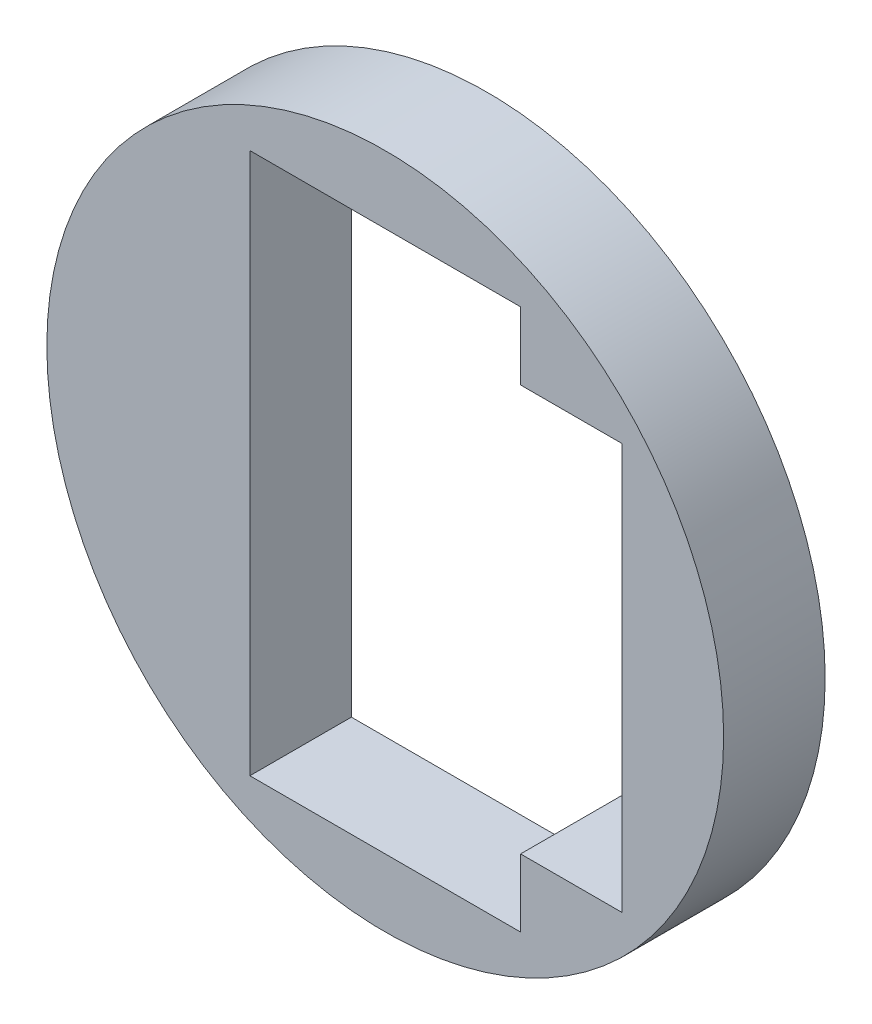
ISO-10303-21;
HEADER;
FILE_DESCRIPTION(('STEP AP214'),'2;1');
FILE_NAME('part.step','',(''),(''),'','','');
FILE_SCHEMA(('AUTOMOTIVE_DESIGN { 1 0 10303 214 1 1 1 1 }'));
ENDSEC;
DATA;
#1=APPLICATION_CONTEXT('core data for automotive mechanical design processes');
#2=APPLICATION_PROTOCOL_DEFINITION('international standard','automotive_design',2000,#1);
#3=PRODUCT_CONTEXT('',#1,'mechanical');
#4=PRODUCT('Part','Part','',(#3));
#5=PRODUCT_RELATED_PRODUCT_CATEGORY('part','',(#4));
#6=PRODUCT_DEFINITION_FORMATION('','',#4);
#7=PRODUCT_DEFINITION_CONTEXT('part definition',#1,'design');
#8=PRODUCT_DEFINITION('design','',#6,#7);
#9=PRODUCT_DEFINITION_SHAPE('','',#8);
#10=(LENGTH_UNIT() NAMED_UNIT(*) SI_UNIT(.MILLI.,.METRE.));
#11=(NAMED_UNIT(*) PLANE_ANGLE_UNIT() SI_UNIT($,.RADIAN.));
#12=(NAMED_UNIT(*) SI_UNIT($,.STERADIAN.) SOLID_ANGLE_UNIT());
#13=UNCERTAINTY_MEASURE_WITH_UNIT(LENGTH_MEASURE(1.E-05),#10,'distance_accuracy_value','');
#14=(GEOMETRIC_REPRESENTATION_CONTEXT(3) GLOBAL_UNCERTAINTY_ASSIGNED_CONTEXT((#13)) GLOBAL_UNIT_ASSIGNED_CONTEXT((#10,
#11,#12)) REPRESENTATION_CONTEXT('',''));
#15=CARTESIAN_POINT('',(0.,0.,0.));
#16=DIRECTION('',(0.,0.,1.));
#17=DIRECTION('',(1.,0.,0.));
#18=AXIS2_PLACEMENT_3D('',#15,#16,#17);
#19=CARTESIAN_POINT('',(0.,0.,3.));
#20=DIRECTION('',(0.,0.,-1.));
#21=DIRECTION('',(-1.,0.,0.));
#22=AXIS2_PLACEMENT_3D('',#19,#20,#21);
#23=CYLINDRICAL_SURFACE('',#22,10.);
#24=CARTESIAN_POINT('',(0.,0.,3.));
#25=DIRECTION('',(0.,0.,1.));
#26=DIRECTION('',(1.,0.,0.));
#27=AXIS2_PLACEMENT_3D('',#24,#25,#26);
#28=CIRCLE('',#27,10.);
#29=CARTESIAN_POINT('',(10.,0.,3.));
#30=VERTEX_POINT('',#29);
#31=EDGE_CURVE('E11',#30,#30,#28,.T.);
#32=ORIENTED_EDGE('',*,*,#31,.F.);
#33=EDGE_LOOP('',(#32));
#34=FACE_BOUND('',#33,.T.);
#35=CARTESIAN_POINT('',(0.,0.,0.));
#36=DIRECTION('',(0.,0.,1.));
#37=DIRECTION('',(1.,0.,0.));
#38=AXIS2_PLACEMENT_3D('',#35,#36,#37);
#39=CIRCLE('',#38,10.);
#40=CARTESIAN_POINT('',(10.,0.,0.));
#41=VERTEX_POINT('',#40);
#42=EDGE_CURVE('E36',#41,#41,#39,.T.);
#43=ORIENTED_EDGE('',*,*,#42,.T.);
#44=EDGE_LOOP('',(#43));
#45=FACE_BOUND('',#44,.T.);
#46=ADVANCED_FACE('F33',(#34,#45),#23,.T.);
#47=CARTESIAN_POINT('',(0.,0.,3.));
#48=DIRECTION('',(0.,0.,1.));
#49=DIRECTION('',(1.,0.,0.));
#50=AXIS2_PLACEMENT_3D('',#47,#48,#49);
#51=PLANE('',#50);
#52=DIRECTION('',(-1.,0.,0.));
#53=VECTOR('',#52,1.);
#54=CARTESIAN_POINT('',(4.,8.,3.));
#55=LINE('',#54,#53);
#56=CARTESIAN_POINT('',(4.,8.,3.));
#57=VERTEX_POINT('',#56);
#58=CARTESIAN_POINT('',(-4.,8.,3.));
#59=VERTEX_POINT('',#58);
#60=EDGE_CURVE('E47',#57,#59,#55,.T.);
#61=ORIENTED_EDGE('',*,*,#60,.F.);
#62=DIRECTION('',(0.,1.,0.));
#63=VECTOR('',#62,1.);
#64=CARTESIAN_POINT('',(4.,6.,3.));
#65=LINE('',#64,#63);
#66=CARTESIAN_POINT('',(4.,6.,3.));
#67=VERTEX_POINT('',#66);
#68=EDGE_CURVE('E116',#67,#57,#65,.T.);
#69=ORIENTED_EDGE('',*,*,#68,.F.);
#70=DIRECTION('',(-1.,0.,0.));
#71=VECTOR('',#70,1.);
#72=CARTESIAN_POINT('',(7.,6.,3.));
#73=LINE('',#72,#71);
#74=CARTESIAN_POINT('',(7.,6.,3.));
#75=VERTEX_POINT('',#74);
#76=EDGE_CURVE('E119',#75,#67,#73,.T.);
#77=ORIENTED_EDGE('',*,*,#76,.F.);
#78=DIRECTION('',(0.,1.,0.));
#79=VECTOR('',#78,1.);
#80=CARTESIAN_POINT('',(7.,-6.,3.));
#81=LINE('',#80,#79);
#82=CARTESIAN_POINT('',(7.,-6.,3.));
#83=VERTEX_POINT('',#82);
#84=EDGE_CURVE('E147',#83,#75,#81,.T.);
#85=ORIENTED_EDGE('',*,*,#84,.F.);
#86=DIRECTION('',(1.,0.,0.));
#87=VECTOR('',#86,1.);
#88=CARTESIAN_POINT('',(4.,-6.,3.));
#89=LINE('',#88,#87);
#90=CARTESIAN_POINT('',(4.,-6.,3.));
#91=VERTEX_POINT('',#90);
#92=EDGE_CURVE('E144',#91,#83,#89,.T.);
#93=ORIENTED_EDGE('',*,*,#92,.F.);
#94=DIRECTION('',(0.,1.,0.));
#95=VECTOR('',#94,1.);
#96=CARTESIAN_POINT('',(4.,-8.,3.));
#97=LINE('',#96,#95);
#98=CARTESIAN_POINT('',(4.,-8.,3.));
#99=VERTEX_POINT('',#98);
#100=EDGE_CURVE('E141',#99,#91,#97,.T.);
#101=ORIENTED_EDGE('',*,*,#100,.F.);
#102=DIRECTION('',(1.,0.,0.));
#103=VECTOR('',#102,1.);
#104=CARTESIAN_POINT('',(-4.,-8.,3.));
#105=LINE('',#104,#103);
#106=CARTESIAN_POINT('',(-4.,-8.,3.));
#107=VERTEX_POINT('',#106);
#108=EDGE_CURVE('E138',#107,#99,#105,.T.);
#109=ORIENTED_EDGE('',*,*,#108,.F.);
#110=DIRECTION('',(0.,-1.,0.));
#111=VECTOR('',#110,1.);
#112=CARTESIAN_POINT('',(-4.,8.,3.));
#113=LINE('',#112,#111);
#114=EDGE_CURVE('E136',#59,#107,#113,.T.);
#115=ORIENTED_EDGE('',*,*,#114,.F.);
#116=EDGE_LOOP('',(#61,#69,#77,#85,#93,#101,#109,#115));
#117=FACE_BOUND('',#116,.T.);
#118=ORIENTED_EDGE('',*,*,#31,.T.);
#119=EDGE_LOOP('',(#118));
#120=FACE_BOUND('',#119,.T.);
#121=ADVANCED_FACE('F168',(#117,#120),#51,.T.);
#122=CARTESIAN_POINT('',(0.,0.,0.));
#123=DIRECTION('',(0.,0.,1.));
#124=DIRECTION('',(1.,0.,0.));
#125=AXIS2_PLACEMENT_3D('',#122,#123,#124);
#126=PLANE('',#125);
#127=DIRECTION('',(0.,1.,0.));
#128=VECTOR('',#127,1.);
#129=CARTESIAN_POINT('',(4.,6.,0.));
#130=LINE('',#129,#128);
#131=CARTESIAN_POINT('',(4.,6.,0.));
#132=VERTEX_POINT('',#131);
#133=CARTESIAN_POINT('',(4.,8.,0.));
#134=VERTEX_POINT('',#133);
#135=EDGE_CURVE('E105',#132,#134,#130,.T.);
#136=ORIENTED_EDGE('',*,*,#135,.T.);
#137=DIRECTION('',(-1.,0.,0.));
#138=VECTOR('',#137,1.);
#139=CARTESIAN_POINT('',(4.,8.,0.));
#140=LINE('',#139,#138);
#141=CARTESIAN_POINT('',(-4.,8.,0.));
#142=VERTEX_POINT('',#141);
#143=EDGE_CURVE('E99',#134,#142,#140,.T.);
#144=ORIENTED_EDGE('',*,*,#143,.T.);
#145=DIRECTION('',(0.,-1.,0.));
#146=VECTOR('',#145,1.);
#147=CARTESIAN_POINT('',(-4.,8.,0.));
#148=LINE('',#147,#146);
#149=CARTESIAN_POINT('',(-4.,-8.,0.));
#150=VERTEX_POINT('',#149);
#151=EDGE_CURVE('E108',#142,#150,#148,.T.);
#152=ORIENTED_EDGE('',*,*,#151,.T.);
#153=DIRECTION('',(1.,0.,0.));
#154=VECTOR('',#153,1.);
#155=CARTESIAN_POINT('',(-4.,-8.,0.));
#156=LINE('',#155,#154);
#157=CARTESIAN_POINT('',(4.,-8.,0.));
#158=VERTEX_POINT('',#157);
#159=EDGE_CURVE('E55',#150,#158,#156,.T.);
#160=ORIENTED_EDGE('',*,*,#159,.T.);
#161=DIRECTION('',(0.,1.,0.));
#162=VECTOR('',#161,1.);
#163=CARTESIAN_POINT('',(4.,-8.,0.));
#164=LINE('',#163,#162);
#165=CARTESIAN_POINT('',(4.,-6.,0.));
#166=VERTEX_POINT('',#165);
#167=EDGE_CURVE('E123',#158,#166,#164,.T.);
#168=ORIENTED_EDGE('',*,*,#167,.T.);
#169=DIRECTION('',(1.,0.,0.));
#170=VECTOR('',#169,1.);
#171=CARTESIAN_POINT('',(4.,-6.,0.));
#172=LINE('',#171,#170);
#173=CARTESIAN_POINT('',(7.,-6.,0.));
#174=VERTEX_POINT('',#173);
#175=EDGE_CURVE('E126',#166,#174,#172,.T.);
#176=ORIENTED_EDGE('',*,*,#175,.T.);
#177=DIRECTION('',(0.,1.,0.));
#178=VECTOR('',#177,1.);
#179=CARTESIAN_POINT('',(7.,-6.,0.));
#180=LINE('',#179,#178);
#181=CARTESIAN_POINT('',(7.,6.,0.));
#182=VERTEX_POINT('',#181);
#183=EDGE_CURVE('E129',#174,#182,#180,.T.);
#184=ORIENTED_EDGE('',*,*,#183,.T.);
#185=DIRECTION('',(-1.,0.,0.));
#186=VECTOR('',#185,1.);
#187=CARTESIAN_POINT('',(7.,6.,0.));
#188=LINE('',#187,#186);
#189=EDGE_CURVE('E132',#182,#132,#188,.T.);
#190=ORIENTED_EDGE('',*,*,#189,.T.);
#191=EDGE_LOOP('',(#136,#144,#152,#160,#168,#176,#184,#190));
#192=FACE_BOUND('',#191,.T.);
#193=ORIENTED_EDGE('',*,*,#42,.F.);
#194=EDGE_LOOP('',(#193));
#195=FACE_BOUND('',#194,.T.);
#196=ADVANCED_FACE('F112',(#192,#195),#126,.F.);
#197=CARTESIAN_POINT('',(4.,8.,0.));
#198=DIRECTION('',(0.,1.,0.));
#199=DIRECTION('',(-1.,0.,0.));
#200=AXIS2_PLACEMENT_3D('',#197,#198,#199);
#201=PLANE('',#200);
#202=ORIENTED_EDGE('',*,*,#60,.T.);
#203=DIRECTION('',(0.,0.,1.));
#204=VECTOR('',#203,1.);
#205=CARTESIAN_POINT('',(-4.,8.,0.));
#206=LINE('',#205,#204);
#207=EDGE_CURVE('E95',#142,#59,#206,.T.);
#208=ORIENTED_EDGE('',*,*,#207,.F.);
#209=ORIENTED_EDGE('',*,*,#143,.F.);
#210=DIRECTION('',(0.,0.,1.));
#211=VECTOR('',#210,1.);
#212=CARTESIAN_POINT('',(4.,8.,0.));
#213=LINE('',#212,#211);
#214=EDGE_CURVE('E152',#134,#57,#213,.T.);
#215=ORIENTED_EDGE('',*,*,#214,.T.);
#216=EDGE_LOOP('',(#202,#208,#209,#215));
#217=FACE_BOUND('',#216,.T.);
#218=ADVANCED_FACE('F97',(#217),#201,.F.);
#219=CARTESIAN_POINT('',(4.,6.,0.));
#220=DIRECTION('',(1.,0.,0.));
#221=DIRECTION('',(0.,1.,0.));
#222=AXIS2_PLACEMENT_3D('',#219,#220,#221);
#223=PLANE('',#222);
#224=ORIENTED_EDGE('',*,*,#68,.T.);
#225=ORIENTED_EDGE('',*,*,#214,.F.);
#226=ORIENTED_EDGE('',*,*,#135,.F.);
#227=DIRECTION('',(0.,0.,1.));
#228=VECTOR('',#227,1.);
#229=CARTESIAN_POINT('',(4.,6.,0.));
#230=LINE('',#229,#228);
#231=EDGE_CURVE('E154',#132,#67,#230,.T.);
#232=ORIENTED_EDGE('',*,*,#231,.T.);
#233=EDGE_LOOP('',(#224,#225,#226,#232));
#234=FACE_BOUND('',#233,.T.);
#235=ADVANCED_FACE('F187',(#234),#223,.F.);
#236=CARTESIAN_POINT('',(7.,6.,0.));
#237=DIRECTION('',(0.,1.,0.));
#238=DIRECTION('',(0.,0.,1.));
#239=AXIS2_PLACEMENT_3D('',#236,#237,#238);
#240=PLANE('',#239);
#241=ORIENTED_EDGE('',*,*,#76,.T.);
#242=ORIENTED_EDGE('',*,*,#231,.F.);
#243=ORIENTED_EDGE('',*,*,#189,.F.);
#244=DIRECTION('',(0.,0.,1.));
#245=VECTOR('',#244,1.);
#246=CARTESIAN_POINT('',(7.,6.,0.));
#247=LINE('',#246,#245);
#248=EDGE_CURVE('E156',#182,#75,#247,.T.);
#249=ORIENTED_EDGE('',*,*,#248,.T.);
#250=EDGE_LOOP('',(#241,#242,#243,#249));
#251=FACE_BOUND('',#250,.T.);
#252=ADVANCED_FACE('F184',(#251),#240,.F.);
#253=CARTESIAN_POINT('',(7.,-6.,0.));
#254=DIRECTION('',(1.,0.,0.));
#255=DIRECTION('',(0.,0.,-1.));
#256=AXIS2_PLACEMENT_3D('',#253,#254,#255);
#257=PLANE('',#256);
#258=ORIENTED_EDGE('',*,*,#84,.T.);
#259=ORIENTED_EDGE('',*,*,#248,.F.);
#260=ORIENTED_EDGE('',*,*,#183,.F.);
#261=DIRECTION('',(0.,0.,1.));
#262=VECTOR('',#261,1.);
#263=CARTESIAN_POINT('',(7.,-6.,0.));
#264=LINE('',#263,#262);
#265=EDGE_CURVE('E158',#174,#83,#264,.T.);
#266=ORIENTED_EDGE('',*,*,#265,.T.);
#267=EDGE_LOOP('',(#258,#259,#260,#266));
#268=FACE_BOUND('',#267,.T.);
#269=ADVANCED_FACE('F180',(#268),#257,.F.);
#270=CARTESIAN_POINT('',(4.,-6.,0.));
#271=DIRECTION('',(0.,-1.,0.));
#272=DIRECTION('',(0.,0.,-1.));
#273=AXIS2_PLACEMENT_3D('',#270,#271,#272);
#274=PLANE('',#273);
#275=ORIENTED_EDGE('',*,*,#92,.T.);
#276=ORIENTED_EDGE('',*,*,#265,.F.);
#277=ORIENTED_EDGE('',*,*,#175,.F.);
#278=DIRECTION('',(0.,0.,1.));
#279=VECTOR('',#278,1.);
#280=CARTESIAN_POINT('',(4.,-6.,0.));
#281=LINE('',#280,#279);
#282=EDGE_CURVE('E160',#166,#91,#281,.T.);
#283=ORIENTED_EDGE('',*,*,#282,.T.);
#284=EDGE_LOOP('',(#275,#276,#277,#283));
#285=FACE_BOUND('',#284,.T.);
#286=ADVANCED_FACE('F178',(#285),#274,.F.);
#287=CARTESIAN_POINT('',(4.,-8.,0.));
#288=DIRECTION('',(1.,0.,0.));
#289=DIRECTION('',(0.,0.,-1.));
#290=AXIS2_PLACEMENT_3D('',#287,#288,#289);
#291=PLANE('',#290);
#292=ORIENTED_EDGE('',*,*,#100,.T.);
#293=ORIENTED_EDGE('',*,*,#282,.F.);
#294=ORIENTED_EDGE('',*,*,#167,.F.);
#295=DIRECTION('',(0.,0.,1.));
#296=VECTOR('',#295,1.);
#297=CARTESIAN_POINT('',(4.,-8.,0.));
#298=LINE('',#297,#296);
#299=EDGE_CURVE('E162',#158,#99,#298,.T.);
#300=ORIENTED_EDGE('',*,*,#299,.T.);
#301=EDGE_LOOP('',(#292,#293,#294,#300));
#302=FACE_BOUND('',#301,.T.);
#303=ADVANCED_FACE('F173',(#302),#291,.F.);
#304=CARTESIAN_POINT('',(-4.,-8.,0.));
#305=DIRECTION('',(0.,-1.,0.));
#306=DIRECTION('',(0.,0.,-1.));
#307=AXIS2_PLACEMENT_3D('',#304,#305,#306);
#308=PLANE('',#307);
#309=ORIENTED_EDGE('',*,*,#108,.T.);
#310=ORIENTED_EDGE('',*,*,#299,.F.);
#311=ORIENTED_EDGE('',*,*,#159,.F.);
#312=DIRECTION('',(0.,0.,1.));
#313=VECTOR('',#312,1.);
#314=CARTESIAN_POINT('',(-4.,-8.,0.));
#315=LINE('',#314,#313);
#316=EDGE_CURVE('E104',#150,#107,#315,.T.);
#317=ORIENTED_EDGE('',*,*,#316,.T.);
#318=EDGE_LOOP('',(#309,#310,#311,#317));
#319=FACE_BOUND('',#318,.T.);
#320=ADVANCED_FACE('F164',(#319),#308,.F.);
#321=CARTESIAN_POINT('',(-4.,8.,0.));
#322=DIRECTION('',(-1.,0.,0.));
#323=DIRECTION('',(0.,-1.,0.));
#324=AXIS2_PLACEMENT_3D('',#321,#322,#323);
#325=PLANE('',#324);
#326=ORIENTED_EDGE('',*,*,#114,.T.);
#327=ORIENTED_EDGE('',*,*,#316,.F.);
#328=ORIENTED_EDGE('',*,*,#151,.F.);
#329=ORIENTED_EDGE('',*,*,#207,.T.);
#330=EDGE_LOOP('',(#326,#327,#328,#329));
#331=FACE_BOUND('',#330,.T.);
#332=ADVANCED_FACE('F109',(#331),#325,.F.);
#333=CLOSED_SHELL('',(#46,#121,#196,#218,#235,#252,#269,#286,#303,#320,#332));
#334=MANIFOLD_SOLID_BREP('B2',#333);
#335=ADVANCED_BREP_SHAPE_REPRESENTATION('',(#18,#334),#14);
#336=SHAPE_DEFINITION_REPRESENTATION(#9,#335);
ENDSEC;
END-ISO-10303-21;
